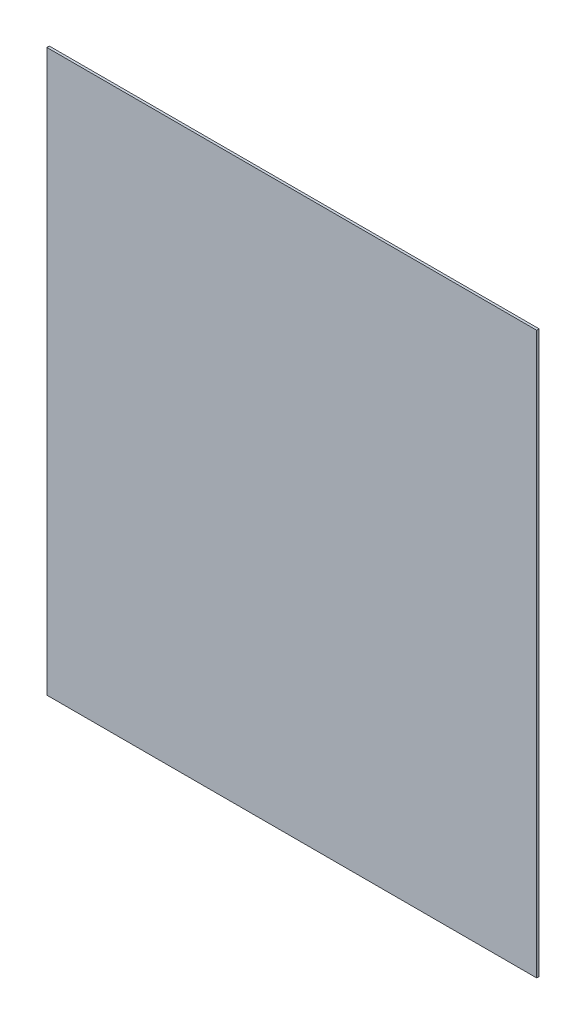
ISO-10303-21;
HEADER;
FILE_DESCRIPTION(('STEP AP214'),'2;1');
FILE_NAME('part.step','',(''),(''),'','','');
FILE_SCHEMA(('AUTOMOTIVE_DESIGN { 1 0 10303 214 1 1 1 1 }'));
ENDSEC;
DATA;
#1=APPLICATION_CONTEXT('core data for automotive mechanical design processes');
#2=APPLICATION_PROTOCOL_DEFINITION('international standard','automotive_design',2000,#1);
#3=PRODUCT_CONTEXT('',#1,'mechanical');
#4=PRODUCT('Part','Part','',(#3));
#5=PRODUCT_RELATED_PRODUCT_CATEGORY('part','',(#4));
#6=PRODUCT_DEFINITION_FORMATION('','',#4);
#7=PRODUCT_DEFINITION_CONTEXT('part definition',#1,'design');
#8=PRODUCT_DEFINITION('design','',#6,#7);
#9=PRODUCT_DEFINITION_SHAPE('','',#8);
#10=(LENGTH_UNIT() NAMED_UNIT(*) SI_UNIT(.MILLI.,.METRE.));
#11=(NAMED_UNIT(*) PLANE_ANGLE_UNIT() SI_UNIT($,.RADIAN.));
#12=(NAMED_UNIT(*) SI_UNIT($,.STERADIAN.) SOLID_ANGLE_UNIT());
#13=UNCERTAINTY_MEASURE_WITH_UNIT(LENGTH_MEASURE(1.E-05),#10,'distance_accuracy_value','');
#14=(GEOMETRIC_REPRESENTATION_CONTEXT(3) GLOBAL_UNCERTAINTY_ASSIGNED_CONTEXT((#13)) GLOBAL_UNIT_ASSIGNED_CONTEXT((#10,
#11,#12)) REPRESENTATION_CONTEXT('',''));
#15=CARTESIAN_POINT('',(0.,0.,0.));
#16=DIRECTION('',(0.,0.,1.));
#17=DIRECTION('',(1.,0.,0.));
#18=AXIS2_PLACEMENT_3D('',#15,#16,#17);
#19=CARTESIAN_POINT('',(254.,-290.83,2.54));
#20=DIRECTION('',(-1.,0.,0.));
#21=DIRECTION('',(0.,0.,1.));
#22=AXIS2_PLACEMENT_3D('',#19,#20,#21);
#23=PLANE('',#22);
#24=DIRECTION('',(0.,1.,0.));
#25=VECTOR('',#24,1.);
#26=CARTESIAN_POINT('',(254.,-290.83,0.));
#27=LINE('',#26,#25);
#28=CARTESIAN_POINT('',(254.,-290.83,0.));
#29=VERTEX_POINT('',#28);
#30=CARTESIAN_POINT('',(254.,290.83,0.));
#31=VERTEX_POINT('',#30);
#32=EDGE_CURVE('E118',#29,#31,#27,.T.);
#33=ORIENTED_EDGE('',*,*,#32,.T.);
#34=DIRECTION('',(0.,0.,-1.));
#35=VECTOR('',#34,1.);
#36=CARTESIAN_POINT('',(254.,290.83,2.54));
#37=LINE('',#36,#35);
#38=CARTESIAN_POINT('',(254.,290.83,2.54));
#39=VERTEX_POINT('',#38);
#40=EDGE_CURVE('E12',#39,#31,#37,.T.);
#41=ORIENTED_EDGE('',*,*,#40,.F.);
#42=DIRECTION('',(0.,1.,0.));
#43=VECTOR('',#42,1.);
#44=CARTESIAN_POINT('',(254.,-290.83,2.54));
#45=LINE('',#44,#43);
#46=CARTESIAN_POINT('',(254.,-290.83,2.54));
#47=VERTEX_POINT('',#46);
#48=EDGE_CURVE('E87',#47,#39,#45,.T.);
#49=ORIENTED_EDGE('',*,*,#48,.F.);
#50=DIRECTION('',(0.,0.,-1.));
#51=VECTOR('',#50,1.);
#52=CARTESIAN_POINT('',(254.,-290.83,2.54));
#53=LINE('',#52,#51);
#54=EDGE_CURVE('E98',#47,#29,#53,.T.);
#55=ORIENTED_EDGE('',*,*,#54,.T.);
#56=EDGE_LOOP('',(#33,#41,#49,#55));
#57=FACE_BOUND('',#56,.T.);
#58=ADVANCED_FACE('F36',(#57),#23,.F.);
#59=CARTESIAN_POINT('',(-254.,290.83,2.54));
#60=DIRECTION('',(0.,-1.,0.));
#61=DIRECTION('',(0.,0.,-1.));
#62=AXIS2_PLACEMENT_3D('',#59,#60,#61);
#63=PLANE('',#62);
#64=DIRECTION('',(-1.,0.,0.));
#65=VECTOR('',#64,1.);
#66=CARTESIAN_POINT('',(-254.,290.83,0.));
#67=LINE('',#66,#65);
#68=CARTESIAN_POINT('',(-254.,290.83,0.));
#69=VERTEX_POINT('',#68);
#70=EDGE_CURVE('E92',#31,#69,#67,.T.);
#71=ORIENTED_EDGE('',*,*,#70,.T.);
#72=DIRECTION('',(0.,0.,-1.));
#73=VECTOR('',#72,1.);
#74=CARTESIAN_POINT('',(-254.,290.83,2.54));
#75=LINE('',#74,#73);
#76=CARTESIAN_POINT('',(-254.,290.83,2.54));
#77=VERTEX_POINT('',#76);
#78=EDGE_CURVE('E44',#77,#69,#75,.T.);
#79=ORIENTED_EDGE('',*,*,#78,.F.);
#80=DIRECTION('',(-1.,0.,0.));
#81=VECTOR('',#80,1.);
#82=CARTESIAN_POINT('',(-254.,290.83,2.54));
#83=LINE('',#82,#81);
#84=EDGE_CURVE('E82',#39,#77,#83,.T.);
#85=ORIENTED_EDGE('',*,*,#84,.F.);
#86=ORIENTED_EDGE('',*,*,#40,.T.);
#87=EDGE_LOOP('',(#71,#79,#85,#86));
#88=FACE_BOUND('',#87,.T.);
#89=ADVANCED_FACE('F91',(#88),#63,.F.);
#90=CARTESIAN_POINT('',(-254.,-290.83,2.54));
#91=DIRECTION('',(1.,0.,0.));
#92=DIRECTION('',(0.,0.,-1.));
#93=AXIS2_PLACEMENT_3D('',#90,#91,#92);
#94=PLANE('',#93);
#95=DIRECTION('',(0.,-1.,0.));
#96=VECTOR('',#95,1.);
#97=CARTESIAN_POINT('',(-254.,-290.83,0.));
#98=LINE('',#97,#96);
#99=CARTESIAN_POINT('',(-254.,-290.83,0.));
#100=VERTEX_POINT('',#99);
#101=EDGE_CURVE('E69',#69,#100,#98,.T.);
#102=ORIENTED_EDGE('',*,*,#101,.T.);
#103=DIRECTION('',(0.,0.,-1.));
#104=VECTOR('',#103,1.);
#105=CARTESIAN_POINT('',(-254.,-290.83,2.54));
#106=LINE('',#105,#104);
#107=CARTESIAN_POINT('',(-254.,-290.83,2.54));
#108=VERTEX_POINT('',#107);
#109=EDGE_CURVE('E93',#108,#100,#106,.T.);
#110=ORIENTED_EDGE('',*,*,#109,.F.);
#111=DIRECTION('',(0.,-1.,0.));
#112=VECTOR('',#111,1.);
#113=CARTESIAN_POINT('',(-254.,-290.83,2.54));
#114=LINE('',#113,#112);
#115=EDGE_CURVE('E85',#77,#108,#114,.T.);
#116=ORIENTED_EDGE('',*,*,#115,.F.);
#117=ORIENTED_EDGE('',*,*,#78,.T.);
#118=EDGE_LOOP('',(#102,#110,#116,#117));
#119=FACE_BOUND('',#118,.T.);
#120=ADVANCED_FACE('F94',(#119),#94,.F.);
#121=CARTESIAN_POINT('',(-254.,-290.83,2.54));
#122=DIRECTION('',(0.,1.,0.));
#123=DIRECTION('',(0.,0.,1.));
#124=AXIS2_PLACEMENT_3D('',#121,#122,#123);
#125=PLANE('',#124);
#126=DIRECTION('',(1.,0.,0.));
#127=VECTOR('',#126,1.);
#128=CARTESIAN_POINT('',(-254.,-290.83,0.));
#129=LINE('',#128,#127);
#130=EDGE_CURVE('E75',#100,#29,#129,.T.);
#131=ORIENTED_EDGE('',*,*,#130,.T.);
#132=ORIENTED_EDGE('',*,*,#54,.F.);
#133=DIRECTION('',(1.,0.,0.));
#134=VECTOR('',#133,1.);
#135=CARTESIAN_POINT('',(-254.,-290.83,2.54));
#136=LINE('',#135,#134);
#137=EDGE_CURVE('E52',#108,#47,#136,.T.);
#138=ORIENTED_EDGE('',*,*,#137,.F.);
#139=ORIENTED_EDGE('',*,*,#109,.T.);
#140=EDGE_LOOP('',(#131,#132,#138,#139));
#141=FACE_BOUND('',#140,.T.);
#142=ADVANCED_FACE('F113',(#141),#125,.F.);
#143=CARTESIAN_POINT('',(0.,0.,2.54));
#144=DIRECTION('',(0.,0.,-1.));
#145=DIRECTION('',(-1.,0.,0.));
#146=AXIS2_PLACEMENT_3D('',#143,#144,#145);
#147=PLANE('',#146);
#148=ORIENTED_EDGE('',*,*,#48,.T.);
#149=ORIENTED_EDGE('',*,*,#84,.T.);
#150=ORIENTED_EDGE('',*,*,#115,.T.);
#151=ORIENTED_EDGE('',*,*,#137,.T.);
#152=EDGE_LOOP('',(#148,#149,#150,#151));
#153=FACE_BOUND('',#152,.T.);
#154=ADVANCED_FACE('F83',(#153),#147,.F.);
#155=CARTESIAN_POINT('',(0.,0.,0.));
#156=DIRECTION('',(0.,0.,-1.));
#157=DIRECTION('',(-1.,0.,0.));
#158=AXIS2_PLACEMENT_3D('',#155,#156,#157);
#159=PLANE('',#158);
#160=ORIENTED_EDGE('',*,*,#32,.F.);
#161=ORIENTED_EDGE('',*,*,#130,.F.);
#162=ORIENTED_EDGE('',*,*,#101,.F.);
#163=ORIENTED_EDGE('',*,*,#70,.F.);
#164=EDGE_LOOP('',(#160,#161,#162,#163));
#165=FACE_BOUND('',#164,.T.);
#166=ADVANCED_FACE('F116',(#165),#159,.T.);
#167=CLOSED_SHELL('',(#58,#89,#120,#142,#154,#166));
#168=MANIFOLD_SOLID_BREP('B2',#167);
#169=ADVANCED_BREP_SHAPE_REPRESENTATION('',(#18,#168),#14);
#170=SHAPE_DEFINITION_REPRESENTATION(#9,#169);
ENDSEC;
END-ISO-10303-21;
